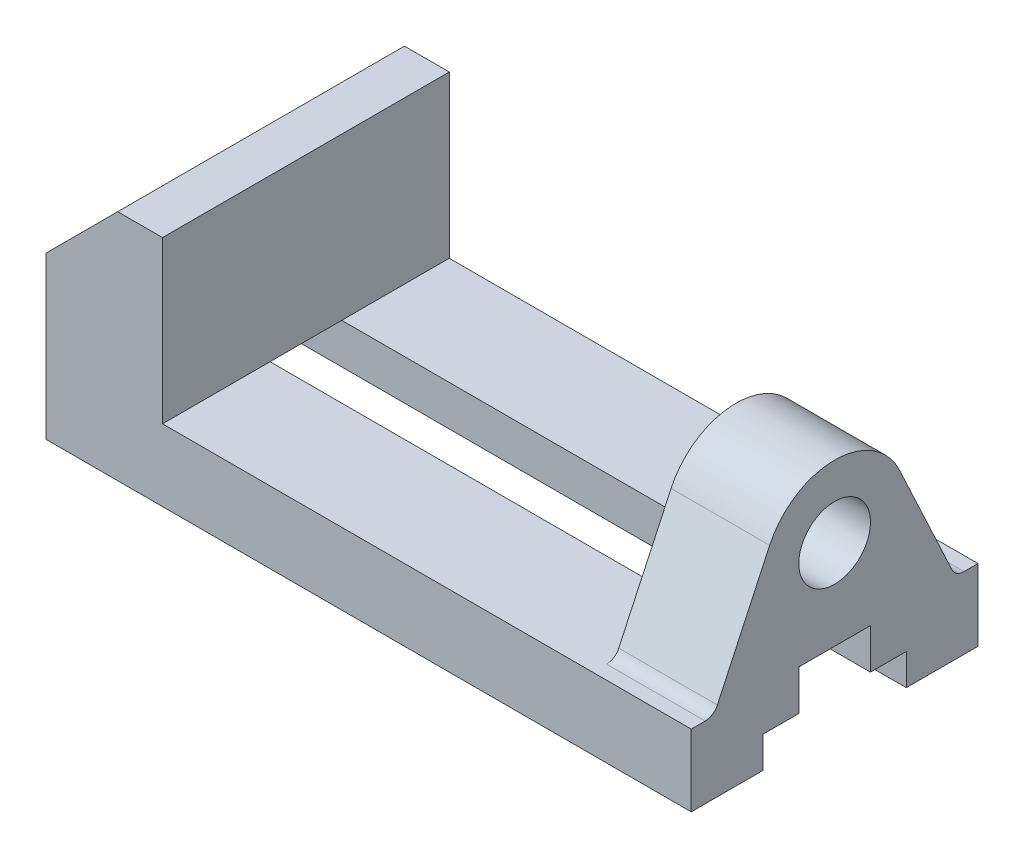
ISO-10303-21;
HEADER;
FILE_DESCRIPTION(('STEP AP214'),'2;1');
FILE_NAME('part.step','',(''),(''),'','','');
FILE_SCHEMA(('AUTOMOTIVE_DESIGN { 1 0 10303 214 1 1 1 1 }'));
ENDSEC;
DATA;
#1=APPLICATION_CONTEXT('core data for automotive mechanical design processes');
#2=APPLICATION_PROTOCOL_DEFINITION('international standard','automotive_design',2000,#1);
#3=PRODUCT_CONTEXT('',#1,'mechanical');
#4=PRODUCT('Part','Part','',(#3));
#5=PRODUCT_RELATED_PRODUCT_CATEGORY('part','',(#4));
#6=PRODUCT_DEFINITION_FORMATION('','',#4);
#7=PRODUCT_DEFINITION_CONTEXT('part definition',#1,'design');
#8=PRODUCT_DEFINITION('design','',#6,#7);
#9=PRODUCT_DEFINITION_SHAPE('','',#8);
#10=(LENGTH_UNIT() NAMED_UNIT(*) SI_UNIT(.MILLI.,.METRE.));
#11=(NAMED_UNIT(*) PLANE_ANGLE_UNIT() SI_UNIT($,.RADIAN.));
#12=(NAMED_UNIT(*) SI_UNIT($,.STERADIAN.) SOLID_ANGLE_UNIT());
#13=UNCERTAINTY_MEASURE_WITH_UNIT(LENGTH_MEASURE(1.E-05),#10,'distance_accuracy_value','');
#14=(GEOMETRIC_REPRESENTATION_CONTEXT(3) GLOBAL_UNCERTAINTY_ASSIGNED_CONTEXT((#13)) GLOBAL_UNIT_ASSIGNED_CONTEXT((#10,
#11,#12)) REPRESENTATION_CONTEXT('',''));
#15=CARTESIAN_POINT('',(0.,0.,0.));
#16=DIRECTION('',(0.,0.,1.));
#17=DIRECTION('',(1.,0.,0.));
#18=AXIS2_PLACEMENT_3D('',#15,#16,#17);
#19=CARTESIAN_POINT('',(0.,16.,0.));
#20=DIRECTION('',(0.,-1.,0.));
#21=DIRECTION('',(0.,0.,-1.));
#22=AXIS2_PLACEMENT_3D('',#19,#20,#21);
#23=PLANE('',#22);
#24=DIRECTION('',(0.,0.,-1.));
#25=VECTOR('',#24,1.);
#26=CARTESIAN_POINT('',(50.,16.,26.9801998664999));
#27=LINE('',#26,#25);
#28=CARTESIAN_POINT('',(50.,16.,28.8914106489223));
#29=VERTEX_POINT('',#28);
#30=CARTESIAN_POINT('',(50.,16.,8.));
#31=VERTEX_POINT('',#30);
#32=EDGE_CURVE('E319',#29,#31,#27,.T.);
#33=ORIENTED_EDGE('',*,*,#32,.T.);
#34=DIRECTION('',(1.,0.,0.));
#35=VECTOR('',#34,1.);
#36=CARTESIAN_POINT('',(-72.,16.,8.));
#37=LINE('',#36,#35);
#38=CARTESIAN_POINT('',(-46.,16.,8.));
#39=VERTEX_POINT('',#38);
#40=EDGE_CURVE('E67',#39,#31,#37,.T.);
#41=ORIENTED_EDGE('',*,*,#40,.F.);
#42=DIRECTION('',(0.,0.,1.));
#43=VECTOR('',#42,1.);
#44=CARTESIAN_POINT('',(-46.,16.,-76.407206622349));
#45=LINE('',#44,#43);
#46=CARTESIAN_POINT('',(-46.,16.,32.));
#47=VERTEX_POINT('',#46);
#48=EDGE_CURVE('E351',#39,#47,#45,.T.);
#49=ORIENTED_EDGE('',*,*,#48,.T.);
#50=DIRECTION('',(1.,0.,0.));
#51=VECTOR('',#50,1.);
#52=CARTESIAN_POINT('',(-72.,16.,32.));
#53=LINE('',#52,#51);
#54=CARTESIAN_POINT('',(72.,16.,32.));
#55=VERTEX_POINT('',#54);
#56=EDGE_CURVE('E370',#47,#55,#53,.T.);
#57=ORIENTED_EDGE('',*,*,#56,.T.);
#58=DIRECTION('',(0.,0.,-1.));
#59=VECTOR('',#58,1.);
#60=CARTESIAN_POINT('',(72.,16.,32.));
#61=LINE('',#60,#59);
#62=CARTESIAN_POINT('',(72.,16.,28.8914106489223));
#63=VERTEX_POINT('',#62);
#64=EDGE_CURVE('E363',#55,#63,#61,.T.);
#65=ORIENTED_EDGE('',*,*,#64,.T.);
#66=DIRECTION('',(1.,0.,0.));
#67=VECTOR('',#66,1.);
#68=CARTESIAN_POINT('',(0.,16.,28.8914106489223));
#69=LINE('',#68,#67);
#70=EDGE_CURVE('E395',#63,#29,#69,.F.);
#71=ORIENTED_EDGE('',*,*,#70,.T.);
#72=EDGE_LOOP('',(#33,#41,#49,#57,#65,#71));
#73=FACE_BOUND('',#72,.T.);
#74=ADVANCED_FACE('F44',(#73),#23,.F.);
#75=CARTESIAN_POINT('',(0.,0.,0.));
#76=DIRECTION('',(0.,-1.,0.));
#77=DIRECTION('',(0.,0.,-1.));
#78=AXIS2_PLACEMENT_3D('',#75,#76,#77);
#79=PLANE('',#78);
#80=CARTESIAN_POINT('',(34.,0.,22.));
#81=DIRECTION('',(0.,-1.,0.));
#82=DIRECTION('',(0.,0.,-1.));
#83=AXIS2_PLACEMENT_3D('',#80,#81,#82);
#84=CIRCLE('',#83,2.49999999999999);
#85=CARTESIAN_POINT('',(34.,0.,19.5));
#86=VERTEX_POINT('',#85);
#87=EDGE_CURVE('E220',#86,#86,#84,.T.);
#88=ORIENTED_EDGE('',*,*,#87,.F.);
#89=EDGE_LOOP('',(#88));
#90=FACE_BOUND('',#89,.T.);
#91=CARTESIAN_POINT('',(-36.,0.,22.));
#92=DIRECTION('',(0.,-1.,0.));
#93=DIRECTION('',(0.,0.,-1.));
#94=AXIS2_PLACEMENT_3D('',#91,#92,#93);
#95=CIRCLE('',#94,2.49999999999999);
#96=CARTESIAN_POINT('',(-36.,0.,19.5));
#97=VERTEX_POINT('',#96);
#98=EDGE_CURVE('E219',#97,#97,#95,.T.);
#99=ORIENTED_EDGE('',*,*,#98,.F.);
#100=EDGE_LOOP('',(#99));
#101=FACE_BOUND('',#100,.T.);
#102=DIRECTION('',(1.,0.,0.));
#103=VECTOR('',#102,1.);
#104=CARTESIAN_POINT('',(-72.,0.,16.));
#105=LINE('',#104,#103);
#106=CARTESIAN_POINT('',(-72.,0.,16.));
#107=VERTEX_POINT('',#106);
#108=CARTESIAN_POINT('',(72.,0.,16.));
#109=VERTEX_POINT('',#108);
#110=EDGE_CURVE('E282',#107,#109,#105,.T.);
#111=ORIENTED_EDGE('',*,*,#110,.T.);
#112=DIRECTION('',(0.,0.,-1.));
#113=VECTOR('',#112,1.);
#114=CARTESIAN_POINT('',(72.,0.,32.));
#115=LINE('',#114,#113);
#116=CARTESIAN_POINT('',(72.,0.,32.));
#117=VERTEX_POINT('',#116);
#118=EDGE_CURVE('E373',#117,#109,#115,.T.);
#119=ORIENTED_EDGE('',*,*,#118,.F.);
#120=DIRECTION('',(1.,0.,0.));
#121=VECTOR('',#120,1.);
#122=CARTESIAN_POINT('',(-72.,0.,32.));
#123=LINE('',#122,#121);
#124=CARTESIAN_POINT('',(-72.,0.,32.));
#125=VERTEX_POINT('',#124);
#126=EDGE_CURVE('E382',#125,#117,#123,.T.);
#127=ORIENTED_EDGE('',*,*,#126,.F.);
#128=DIRECTION('',(0.,0.,1.));
#129=VECTOR('',#128,1.);
#130=CARTESIAN_POINT('',(-72.,0.,32.));
#131=LINE('',#130,#129);
#132=EDGE_CURVE('E378',#107,#125,#131,.T.);
#133=ORIENTED_EDGE('',*,*,#132,.F.);
#134=EDGE_LOOP('',(#111,#119,#127,#133));
#135=FACE_BOUND('',#134,.T.);
#136=ADVANCED_FACE('F506',(#90,#101,#135),#79,.T.);
#137=CARTESIAN_POINT('',(72.,16.,32.));
#138=DIRECTION('',(-1.,0.,0.));
#139=DIRECTION('',(0.,0.,1.));
#140=AXIS2_PLACEMENT_3D('',#137,#138,#139);
#141=PLANE('',#140);
#142=ORIENTED_EDGE('',*,*,#118,.T.);
#143=DIRECTION('',(0.,-1.,0.));
#144=VECTOR('',#143,1.);
#145=CARTESIAN_POINT('',(72.,0.,16.));
#146=LINE('',#145,#144);
#147=CARTESIAN_POINT('',(72.,7.,16.));
#148=VERTEX_POINT('',#147);
#149=EDGE_CURVE('E245',#148,#109,#146,.T.);
#150=ORIENTED_EDGE('',*,*,#149,.F.);
#151=DIRECTION('',(0.,0.,1.));
#152=VECTOR('',#151,1.);
#153=CARTESIAN_POINT('',(72.,7.,16.));
#154=LINE('',#153,#152);
#155=CARTESIAN_POINT('',(72.,7.,8.));
#156=VERTEX_POINT('',#155);
#157=EDGE_CURVE('E278',#156,#148,#154,.T.);
#158=ORIENTED_EDGE('',*,*,#157,.F.);
#159=DIRECTION('',(0.,-1.,0.));
#160=VECTOR('',#159,1.);
#161=CARTESIAN_POINT('',(72.,7.,8.));
#162=LINE('',#161,#160);
#163=CARTESIAN_POINT('',(72.,16.,8.));
#164=VERTEX_POINT('',#163);
#165=EDGE_CURVE('E275',#164,#156,#162,.T.);
#166=ORIENTED_EDGE('',*,*,#165,.F.);
#167=DIRECTION('',(0.,0.,1.));
#168=VECTOR('',#167,1.);
#169=CARTESIAN_POINT('',(72.,16.,8.));
#170=LINE('',#169,#168);
#171=CARTESIAN_POINT('',(72.,16.,-8.));
#172=VERTEX_POINT('',#171);
#173=EDGE_CURVE('E272',#172,#164,#170,.T.);
#174=ORIENTED_EDGE('',*,*,#173,.F.);
#175=DIRECTION('',(0.,1.,0.));
#176=VECTOR('',#175,1.);
#177=CARTESIAN_POINT('',(72.,7.00000000000001,-8.00000000000001));
#178=LINE('',#177,#176);
#179=CARTESIAN_POINT('',(72.,7.00000000000001,-8.00000000000001));
#180=VERTEX_POINT('',#179);
#181=EDGE_CURVE('E269',#180,#172,#178,.T.);
#182=ORIENTED_EDGE('',*,*,#181,.F.);
#183=DIRECTION('',(0.,0.,1.));
#184=VECTOR('',#183,1.);
#185=CARTESIAN_POINT('',(72.,7.00000000000002,-16.));
#186=LINE('',#185,#184);
#187=CARTESIAN_POINT('',(72.,7.00000000000002,-16.));
#188=VERTEX_POINT('',#187);
#189=EDGE_CURVE('E266',#188,#180,#186,.T.);
#190=ORIENTED_EDGE('',*,*,#189,.F.);
#191=DIRECTION('',(0.,1.,0.));
#192=VECTOR('',#191,1.);
#193=CARTESIAN_POINT('',(72.,0.,-16.));
#194=LINE('',#193,#192);
#195=CARTESIAN_POINT('',(72.,0.,-16.));
#196=VERTEX_POINT('',#195);
#197=EDGE_CURVE('E242',#196,#188,#194,.T.);
#198=ORIENTED_EDGE('',*,*,#197,.F.);
#199=CARTESIAN_POINT('',(72.,0.,-32.));
#200=VERTEX_POINT('',#199);
#201=EDGE_CURVE('E362',#196,#200,#115,.T.);
#202=ORIENTED_EDGE('',*,*,#201,.T.);
#203=DIRECTION('',(0.,-1.,0.));
#204=VECTOR('',#203,1.);
#205=CARTESIAN_POINT('',(72.,16.,-32.));
#206=LINE('',#205,#204);
#207=CARTESIAN_POINT('',(72.,16.,-32.));
#208=VERTEX_POINT('',#207);
#209=EDGE_CURVE('E392',#208,#200,#206,.T.);
#210=ORIENTED_EDGE('',*,*,#209,.F.);
#211=CARTESIAN_POINT('',(72.,16.,-28.8914106489224));
#212=VERTEX_POINT('',#211);
#213=EDGE_CURVE('E367',#212,#208,#61,.T.);
#214=ORIENTED_EDGE('',*,*,#213,.F.);
#215=CARTESIAN_POINT('',(72.,19.,-28.8914106489224));
#216=DIRECTION('',(-1.,0.,0.));
#217=DIRECTION('',(0.,0.,1.));
#218=AXIS2_PLACEMENT_3D('',#215,#216,#217);
#219=CIRCLE('',#218,3.);
#220=CARTESIAN_POINT('',(72.,17.7321452147779,-26.1724872878124));
#221=VERTEX_POINT('',#220);
#222=EDGE_CURVE('E406',#212,#221,#219,.T.);
#223=ORIENTED_EDGE('',*,*,#222,.T.);
#224=DIRECTION('',(0.,0.90630778703665,0.4226182617407));
#225=VECTOR('',#224,1.);
#226=CARTESIAN_POINT('',(72.,42.7618921878512,-14.5009245925864));
#227=LINE('',#226,#225);
#228=CARTESIAN_POINT('',(72.,42.7618921878512,-14.5009245925864));
#229=VERTEX_POINT('',#228);
#230=EDGE_CURVE('E315',#221,#229,#227,.T.);
#231=ORIENTED_EDGE('',*,*,#230,.T.);
#232=CARTESIAN_POINT('',(72.,36.,0.));
#233=DIRECTION('',(1.,0.,0.));
#234=DIRECTION('',(0.,0.,-1.));
#235=AXIS2_PLACEMENT_3D('',#232,#233,#234);
#236=CIRCLE('',#235,16.);
#237=CARTESIAN_POINT('',(72.,42.7618921878512,14.5009245925864));
#238=VERTEX_POINT('',#237);
#239=EDGE_CURVE('E308',#229,#238,#236,.T.);
#240=ORIENTED_EDGE('',*,*,#239,.T.);
#241=DIRECTION('',(0.,-0.90630778703665,0.4226182617407));
#242=VECTOR('',#241,1.);
#243=CARTESIAN_POINT('',(72.,42.7618921878512,14.5009245925864));
#244=LINE('',#243,#242);
#245=CARTESIAN_POINT('',(72.,17.7321452147779,26.1724872878124));
#246=VERTEX_POINT('',#245);
#247=EDGE_CURVE('E328',#238,#246,#244,.T.);
#248=ORIENTED_EDGE('',*,*,#247,.T.);
#249=CARTESIAN_POINT('',(72.,19.,28.8914106489223));
#250=DIRECTION('',(-1.,0.,0.));
#251=DIRECTION('',(0.,0.,1.));
#252=AXIS2_PLACEMENT_3D('',#249,#250,#251);
#253=CIRCLE('',#252,3.);
#254=EDGE_CURVE('E52',#246,#63,#253,.T.);
#255=ORIENTED_EDGE('',*,*,#254,.T.);
#256=ORIENTED_EDGE('',*,*,#64,.F.);
#257=DIRECTION('',(0.,-1.,0.));
#258=VECTOR('',#257,1.);
#259=CARTESIAN_POINT('',(72.,16.,32.));
#260=LINE('',#259,#258);
#261=EDGE_CURVE('E372',#55,#117,#260,.T.);
#262=ORIENTED_EDGE('',*,*,#261,.T.);
#263=EDGE_LOOP('',(#142,#150,#158,#166,#174,#182,#190,#198,#202,#210,#214,#223,#231,#240,#248,
#255,#256,#262));
#264=FACE_BOUND('',#263,.T.);
#265=CARTESIAN_POINT('',(72.,36.,0.));
#266=DIRECTION('',(1.,0.,0.));
#267=DIRECTION('',(0.,0.,-1.));
#268=AXIS2_PLACEMENT_3D('',#265,#266,#267);
#269=CIRCLE('',#268,8.);
#270=CARTESIAN_POINT('',(72.,36.,-8.));
#271=VERTEX_POINT('',#270);
#272=EDGE_CURVE('E304',#271,#271,#269,.T.);
#273=ORIENTED_EDGE('',*,*,#272,.F.);
#274=EDGE_LOOP('',(#273));
#275=FACE_BOUND('',#274,.T.);
#276=ADVANCED_FACE('F412',(#264,#275),#141,.F.);
#277=CARTESIAN_POINT('',(-72.,16.,-32.));
#278=DIRECTION('',(0.,0.,1.));
#279=DIRECTION('',(1.,0.,0.));
#280=AXIS2_PLACEMENT_3D('',#277,#278,#279);
#281=PLANE('',#280);
#282=DIRECTION('',(-1.,0.,0.));
#283=VECTOR('',#282,1.);
#284=CARTESIAN_POINT('',(-72.,0.,-32.));
#285=LINE('',#284,#283);
#286=CARTESIAN_POINT('',(-72.,0.,-32.));
#287=VERTEX_POINT('',#286);
#288=EDGE_CURVE('E376',#200,#287,#285,.T.);
#289=ORIENTED_EDGE('',*,*,#288,.T.);
#290=DIRECTION('',(0.,-1.,0.));
#291=VECTOR('',#290,1.);
#292=CARTESIAN_POINT('',(-72.,16.,-32.));
#293=LINE('',#292,#291);
#294=CARTESIAN_POINT('',(-72.,36.,-32.));
#295=VERTEX_POINT('',#294);
#296=EDGE_CURVE('E389',#295,#287,#293,.T.);
#297=ORIENTED_EDGE('',*,*,#296,.F.);
#298=DIRECTION('',(0.707106781186548,0.707106781186547,0.));
#299=VECTOR('',#298,1.);
#300=CARTESIAN_POINT('',(-56.,52.,-32.));
#301=LINE('',#300,#299);
#302=CARTESIAN_POINT('',(-56.,52.,-32.));
#303=VERTEX_POINT('',#302);
#304=EDGE_CURVE('E339',#295,#303,#301,.T.);
#305=ORIENTED_EDGE('',*,*,#304,.T.);
#306=DIRECTION('',(1.,0.,0.));
#307=VECTOR('',#306,1.);
#308=CARTESIAN_POINT('',(-46.,52.,-32.));
#309=LINE('',#308,#307);
#310=CARTESIAN_POINT('',(-46.,52.,-32.));
#311=VERTEX_POINT('',#310);
#312=EDGE_CURVE('E337',#303,#311,#309,.T.);
#313=ORIENTED_EDGE('',*,*,#312,.T.);
#314=DIRECTION('',(0.,-1.,0.));
#315=VECTOR('',#314,1.);
#316=CARTESIAN_POINT('',(-46.,16.,-32.));
#317=LINE('',#316,#315);
#318=CARTESIAN_POINT('',(-46.,16.,-32.));
#319=VERTEX_POINT('',#318);
#320=EDGE_CURVE('E342',#311,#319,#317,.T.);
#321=ORIENTED_EDGE('',*,*,#320,.T.);
#322=DIRECTION('',(-1.,0.,0.));
#323=VECTOR('',#322,1.);
#324=CARTESIAN_POINT('',(-72.,16.,-32.));
#325=LINE('',#324,#323);
#326=EDGE_CURVE('E366',#208,#319,#325,.T.);
#327=ORIENTED_EDGE('',*,*,#326,.F.);
#328=ORIENTED_EDGE('',*,*,#209,.T.);
#329=EDGE_LOOP('',(#289,#297,#305,#313,#321,#327,#328));
#330=FACE_BOUND('',#329,.T.);
#331=ADVANCED_FACE('F452',(#330),#281,.F.);
#332=CARTESIAN_POINT('',(-72.,16.,32.));
#333=DIRECTION('',(1.,0.,0.));
#334=DIRECTION('',(0.,0.,-1.));
#335=AXIS2_PLACEMENT_3D('',#332,#333,#334);
#336=PLANE('',#335);
#337=DIRECTION('',(0.,0.,1.));
#338=VECTOR('',#337,1.);
#339=CARTESIAN_POINT('',(-72.,7.,16.));
#340=LINE('',#339,#338);
#341=CARTESIAN_POINT('',(-72.,7.,8.));
#342=VERTEX_POINT('',#341);
#343=CARTESIAN_POINT('',(-72.,7.,16.));
#344=VERTEX_POINT('',#343);
#345=EDGE_CURVE('E257',#342,#344,#340,.T.);
#346=ORIENTED_EDGE('',*,*,#345,.T.);
#347=DIRECTION('',(0.,-1.,0.));
#348=VECTOR('',#347,1.);
#349=CARTESIAN_POINT('',(-72.,0.,16.));
#350=LINE('',#349,#348);
#351=EDGE_CURVE('E260',#344,#107,#350,.T.);
#352=ORIENTED_EDGE('',*,*,#351,.T.);
#353=ORIENTED_EDGE('',*,*,#132,.T.);
#354=DIRECTION('',(0.,-1.,0.));
#355=VECTOR('',#354,1.);
#356=CARTESIAN_POINT('',(-72.,16.,32.));
#357=LINE('',#356,#355);
#358=CARTESIAN_POINT('',(-72.,36.,32.));
#359=VERTEX_POINT('',#358);
#360=EDGE_CURVE('E386',#359,#125,#357,.T.);
#361=ORIENTED_EDGE('',*,*,#360,.F.);
#362=DIRECTION('',(0.,0.,1.));
#363=VECTOR('',#362,1.);
#364=CARTESIAN_POINT('',(-72.,36.,-76.407206622349));
#365=LINE('',#364,#363);
#366=EDGE_CURVE('E340',#295,#359,#365,.T.);
#367=ORIENTED_EDGE('',*,*,#366,.F.);
#368=ORIENTED_EDGE('',*,*,#296,.T.);
#369=CARTESIAN_POINT('',(-72.,0.,-16.));
#370=VERTEX_POINT('',#369);
#371=EDGE_CURVE('E379',#287,#370,#131,.T.);
#372=ORIENTED_EDGE('',*,*,#371,.T.);
#373=DIRECTION('',(0.,1.,0.));
#374=VECTOR('',#373,1.);
#375=CARTESIAN_POINT('',(-72.,0.,-16.));
#376=LINE('',#375,#374);
#377=CARTESIAN_POINT('',(-72.,7.00000000000002,-16.));
#378=VERTEX_POINT('',#377);
#379=EDGE_CURVE('E59',#370,#378,#376,.T.);
#380=ORIENTED_EDGE('',*,*,#379,.T.);
#381=DIRECTION('',(0.,0.,1.));
#382=VECTOR('',#381,1.);
#383=CARTESIAN_POINT('',(-72.,7.00000000000002,-16.));
#384=LINE('',#383,#382);
#385=CARTESIAN_POINT('',(-72.,7.00000000000001,-8.00000000000001));
#386=VERTEX_POINT('',#385);
#387=EDGE_CURVE('E244',#378,#386,#384,.T.);
#388=ORIENTED_EDGE('',*,*,#387,.T.);
#389=DIRECTION('',(0.,1.,0.));
#390=VECTOR('',#389,1.);
#391=CARTESIAN_POINT('',(-72.,7.00000000000001,-8.00000000000001));
#392=LINE('',#391,#390);
#393=CARTESIAN_POINT('',(-72.,16.,-8.));
#394=VERTEX_POINT('',#393);
#395=EDGE_CURVE('E248',#386,#394,#392,.T.);
#396=ORIENTED_EDGE('',*,*,#395,.T.);
#397=DIRECTION('',(0.,0.,1.));
#398=VECTOR('',#397,1.);
#399=CARTESIAN_POINT('',(-72.,16.,8.));
#400=LINE('',#399,#398);
#401=CARTESIAN_POINT('',(-72.,16.,8.));
#402=VERTEX_POINT('',#401);
#403=EDGE_CURVE('E251',#394,#402,#400,.T.);
#404=ORIENTED_EDGE('',*,*,#403,.T.);
#405=DIRECTION('',(0.,-1.,0.));
#406=VECTOR('',#405,1.);
#407=CARTESIAN_POINT('',(-72.,7.,8.));
#408=LINE('',#407,#406);
#409=EDGE_CURVE('E254',#402,#342,#408,.T.);
#410=ORIENTED_EDGE('',*,*,#409,.T.);
#411=EDGE_LOOP('',(#346,#352,#353,#361,#367,#368,#372,#380,#388,#396,#404,#410));
#412=FACE_BOUND('',#411,.T.);
#413=ADVANCED_FACE('F478',(#412),#336,.F.);
#414=CARTESIAN_POINT('',(-72.,16.,32.));
#415=DIRECTION('',(0.,0.,-1.));
#416=DIRECTION('',(-1.,0.,0.));
#417=AXIS2_PLACEMENT_3D('',#414,#415,#416);
#418=PLANE('',#417);
#419=ORIENTED_EDGE('',*,*,#126,.T.);
#420=ORIENTED_EDGE('',*,*,#261,.F.);
#421=ORIENTED_EDGE('',*,*,#56,.F.);
#422=DIRECTION('',(0.,1.,0.));
#423=VECTOR('',#422,1.);
#424=CARTESIAN_POINT('',(-46.,16.,32.));
#425=LINE('',#424,#423);
#426=CARTESIAN_POINT('',(-46.,52.,32.));
#427=VERTEX_POINT('',#426);
#428=EDGE_CURVE('E335',#47,#427,#425,.T.);
#429=ORIENTED_EDGE('',*,*,#428,.T.);
#430=DIRECTION('',(-1.,0.,0.));
#431=VECTOR('',#430,1.);
#432=CARTESIAN_POINT('',(-46.,52.,32.));
#433=LINE('',#432,#431);
#434=CARTESIAN_POINT('',(-56.,52.,32.));
#435=VERTEX_POINT('',#434);
#436=EDGE_CURVE('E345',#427,#435,#433,.T.);
#437=ORIENTED_EDGE('',*,*,#436,.T.);
#438=DIRECTION('',(-0.707106781186548,-0.707106781186547,0.));
#439=VECTOR('',#438,1.);
#440=CARTESIAN_POINT('',(-56.,52.,32.));
#441=LINE('',#440,#439);
#442=EDGE_CURVE('E348',#435,#359,#441,.T.);
#443=ORIENTED_EDGE('',*,*,#442,.T.);
#444=ORIENTED_EDGE('',*,*,#360,.T.);
#445=EDGE_LOOP('',(#419,#420,#421,#429,#437,#443,#444));
#446=FACE_BOUND('',#445,.T.);
#447=ADVANCED_FACE('F502',(#446),#418,.F.);
#448=CARTESIAN_POINT('',(-46.,16.,-8.));
#449=VERTEX_POINT('',#448);
#450=EDGE_CURVE('E358',#319,#449,#45,.T.);
#451=ORIENTED_EDGE('',*,*,#450,.T.);
#452=DIRECTION('',(1.,0.,0.));
#453=VECTOR('',#452,1.);
#454=CARTESIAN_POINT('',(-72.,16.,-8.));
#455=LINE('',#454,#453);
#456=CARTESIAN_POINT('',(50.,16.,-8.));
#457=VERTEX_POINT('',#456);
#458=EDGE_CURVE('E296',#449,#457,#455,.T.);
#459=ORIENTED_EDGE('',*,*,#458,.T.);
#460=CARTESIAN_POINT('',(50.,16.,-28.8914106489224));
#461=VERTEX_POINT('',#460);
#462=EDGE_CURVE('E318',#457,#461,#27,.T.);
#463=ORIENTED_EDGE('',*,*,#462,.T.);
#464=DIRECTION('',(1.,0.,0.));
#465=VECTOR('',#464,1.);
#466=CARTESIAN_POINT('',(0.,16.,-28.8914106489224));
#467=LINE('',#466,#465);
#468=EDGE_CURVE('E398',#461,#212,#467,.T.);
#469=ORIENTED_EDGE('',*,*,#468,.T.);
#470=ORIENTED_EDGE('',*,*,#213,.T.);
#471=ORIENTED_EDGE('',*,*,#326,.T.);
#472=EDGE_LOOP('',(#451,#459,#463,#469,#470,#471));
#473=FACE_BOUND('',#472,.T.);
#474=ADVANCED_FACE('F443',(#473),#23,.F.);
#475=CARTESIAN_POINT('',(-36.,0.,-22.));
#476=DIRECTION('',(0.,-1.,0.));
#477=DIRECTION('',(0.,0.,-1.));
#478=AXIS2_PLACEMENT_3D('',#475,#476,#477);
#479=CIRCLE('',#478,2.49999999999999);
#480=CARTESIAN_POINT('',(-36.,0.,-24.5));
#481=VERTEX_POINT('',#480);
#482=EDGE_CURVE('E230',#481,#481,#479,.T.);
#483=ORIENTED_EDGE('',*,*,#482,.F.);
#484=EDGE_LOOP('',(#483));
#485=FACE_BOUND('',#484,.T.);
#486=CARTESIAN_POINT('',(34.,0.,-22.));
#487=DIRECTION('',(0.,-1.,0.));
#488=DIRECTION('',(0.,0.,-1.));
#489=AXIS2_PLACEMENT_3D('',#486,#487,#488);
#490=CIRCLE('',#489,2.49999999999999);
#491=CARTESIAN_POINT('',(34.,0.,-24.5));
#492=VERTEX_POINT('',#491);
#493=EDGE_CURVE('E236',#492,#492,#490,.T.);
#494=ORIENTED_EDGE('',*,*,#493,.F.);
#495=EDGE_LOOP('',(#494));
#496=FACE_BOUND('',#495,.T.);
#497=DIRECTION('',(1.,0.,0.));
#498=VECTOR('',#497,1.);
#499=CARTESIAN_POINT('',(-72.,0.,-16.));
#500=LINE('',#499,#498);
#501=EDGE_CURVE('E263',#370,#196,#500,.T.);
#502=ORIENTED_EDGE('',*,*,#501,.F.);
#503=ORIENTED_EDGE('',*,*,#371,.F.);
#504=ORIENTED_EDGE('',*,*,#288,.F.);
#505=ORIENTED_EDGE('',*,*,#201,.F.);
#506=EDGE_LOOP('',(#502,#503,#504,#505));
#507=FACE_BOUND('',#506,.T.);
#508=ADVANCED_FACE('F489',(#485,#496,#507),#79,.T.);
#509=CARTESIAN_POINT('',(-56.,52.,-76.407206622349));
#510=DIRECTION('',(-0.707106781186547,0.707106781186548,0.));
#511=DIRECTION('',(-0.707106781186548,-0.707106781186547,0.));
#512=AXIS2_PLACEMENT_3D('',#509,#510,#511);
#513=PLANE('',#512);
#514=ORIENTED_EDGE('',*,*,#304,.F.);
#515=ORIENTED_EDGE('',*,*,#366,.T.);
#516=ORIENTED_EDGE('',*,*,#442,.F.);
#517=DIRECTION('',(0.,0.,1.));
#518=VECTOR('',#517,1.);
#519=CARTESIAN_POINT('',(-56.,52.,-76.407206622349));
#520=LINE('',#519,#518);
#521=EDGE_CURVE('E354',#303,#435,#520,.T.);
#522=ORIENTED_EDGE('',*,*,#521,.F.);
#523=EDGE_LOOP('',(#514,#515,#516,#522));
#524=FACE_BOUND('',#523,.T.);
#525=ADVANCED_FACE('F495',(#524),#513,.T.);
#526=CARTESIAN_POINT('',(-46.,52.,-76.407206622349));
#527=DIRECTION('',(0.,1.,0.));
#528=DIRECTION('',(0.,0.,1.));
#529=AXIS2_PLACEMENT_3D('',#526,#527,#528);
#530=PLANE('',#529);
#531=ORIENTED_EDGE('',*,*,#312,.F.);
#532=ORIENTED_EDGE('',*,*,#521,.T.);
#533=ORIENTED_EDGE('',*,*,#436,.F.);
#534=DIRECTION('',(0.,0.,1.));
#535=VECTOR('',#534,1.);
#536=CARTESIAN_POINT('',(-46.,52.,-76.407206622349));
#537=LINE('',#536,#535);
#538=EDGE_CURVE('E356',#311,#427,#537,.T.);
#539=ORIENTED_EDGE('',*,*,#538,.F.);
#540=EDGE_LOOP('',(#531,#532,#533,#539));
#541=FACE_BOUND('',#540,.T.);
#542=ADVANCED_FACE('F499',(#541),#530,.T.);
#543=CARTESIAN_POINT('',(-46.,16.,-76.407206622349));
#544=DIRECTION('',(1.,0.,0.));
#545=DIRECTION('',(0.,0.,-1.));
#546=AXIS2_PLACEMENT_3D('',#543,#544,#545);
#547=PLANE('',#546);
#548=ORIENTED_EDGE('',*,*,#320,.F.);
#549=ORIENTED_EDGE('',*,*,#538,.T.);
#550=ORIENTED_EDGE('',*,*,#428,.F.);
#551=ORIENTED_EDGE('',*,*,#48,.F.);
#552=DIRECTION('',(0.,0.,1.));
#553=VECTOR('',#552,1.);
#554=CARTESIAN_POINT('',(-46.,16.,-76.407206622349));
#555=LINE('',#554,#553);
#556=EDGE_CURVE('E285',#449,#39,#555,.T.);
#557=ORIENTED_EDGE('',*,*,#556,.F.);
#558=ORIENTED_EDGE('',*,*,#450,.F.);
#559=EDGE_LOOP('',(#548,#549,#550,#551,#557,#558));
#560=FACE_BOUND('',#559,.T.);
#561=ADVANCED_FACE('F457',(#560),#547,.T.);
#562=CARTESIAN_POINT('',(50.,36.,0.));
#563=DIRECTION('',(1.,0.,0.));
#564=DIRECTION('',(0.,0.,-1.));
#565=AXIS2_PLACEMENT_3D('',#562,#563,#564);
#566=CYLINDRICAL_SURFACE('',#565,16.);
#567=ORIENTED_EDGE('',*,*,#239,.F.);
#568=DIRECTION('',(1.,0.,0.));
#569=VECTOR('',#568,1.);
#570=CARTESIAN_POINT('',(50.,42.7618921878512,-14.5009245925864));
#571=LINE('',#570,#569);
#572=CARTESIAN_POINT('',(50.,42.7618921878512,-14.5009245925864));
#573=VERTEX_POINT('',#572);
#574=EDGE_CURVE('E332',#573,#229,#571,.T.);
#575=ORIENTED_EDGE('',*,*,#574,.F.);
#576=CARTESIAN_POINT('',(50.,36.,0.));
#577=DIRECTION('',(1.,0.,0.));
#578=DIRECTION('',(0.,0.,-1.));
#579=AXIS2_PLACEMENT_3D('',#576,#577,#578);
#580=CIRCLE('',#579,16.);
#581=CARTESIAN_POINT('',(50.,42.7618921878512,14.5009245925864));
#582=VERTEX_POINT('',#581);
#583=EDGE_CURVE('E311',#573,#582,#580,.T.);
#584=ORIENTED_EDGE('',*,*,#583,.T.);
#585=DIRECTION('',(1.,0.,0.));
#586=VECTOR('',#585,1.);
#587=CARTESIAN_POINT('',(50.,42.7618921878512,14.5009245925864));
#588=LINE('',#587,#586);
#589=EDGE_CURVE('E325',#582,#238,#588,.T.);
#590=ORIENTED_EDGE('',*,*,#589,.T.);
#591=EDGE_LOOP('',(#567,#575,#584,#590));
#592=FACE_BOUND('',#591,.T.);
#593=ADVANCED_FACE('F431',(#592),#566,.T.);
#594=CARTESIAN_POINT('',(50.,42.7618921878512,-14.5009245925864));
#595=DIRECTION('',(0.,0.4226182617407,-0.90630778703665));
#596=DIRECTION('',(0.,0.90630778703665,0.4226182617407));
#597=AXIS2_PLACEMENT_3D('',#594,#595,#596);
#598=PLANE('',#597);
#599=ORIENTED_EDGE('',*,*,#230,.F.);
#600=DIRECTION('',(1.,0.,0.));
#601=VECTOR('',#600,1.);
#602=CARTESIAN_POINT('',(50.,17.7321452147779,-26.1724872878124));
#603=LINE('',#602,#601);
#604=CARTESIAN_POINT('',(50.,17.7321452147779,-26.1724872878124));
#605=VERTEX_POINT('',#604);
#606=EDGE_CURVE('E401',#221,#605,#603,.F.);
#607=ORIENTED_EDGE('',*,*,#606,.T.);
#608=DIRECTION('',(0.,0.90630778703665,0.4226182617407));
#609=VECTOR('',#608,1.);
#610=CARTESIAN_POINT('',(50.,42.7618921878512,-14.5009245925864));
#611=LINE('',#610,#609);
#612=EDGE_CURVE('E322',#605,#573,#611,.T.);
#613=ORIENTED_EDGE('',*,*,#612,.T.);
#614=ORIENTED_EDGE('',*,*,#574,.T.);
#615=EDGE_LOOP('',(#599,#607,#613,#614));
#616=FACE_BOUND('',#615,.T.);
#617=ADVANCED_FACE('F560',(#616),#598,.T.);
#618=CARTESIAN_POINT('',(50.,42.7618921878512,14.5009245925864));
#619=DIRECTION('',(0.,0.4226182617407,0.90630778703665));
#620=DIRECTION('',(0.,-0.90630778703665,0.4226182617407));
#621=AXIS2_PLACEMENT_3D('',#618,#619,#620);
#622=PLANE('',#621);
#623=DIRECTION('',(0.,-0.90630778703665,0.4226182617407));
#624=VECTOR('',#623,1.);
#625=CARTESIAN_POINT('',(50.,42.7618921878512,14.5009245925864));
#626=LINE('',#625,#624);
#627=CARTESIAN_POINT('',(50.,17.7321452147779,26.1724872878124));
#628=VERTEX_POINT('',#627);
#629=EDGE_CURVE('E314',#582,#628,#626,.T.);
#630=ORIENTED_EDGE('',*,*,#629,.T.);
#631=DIRECTION('',(1.,0.,0.));
#632=VECTOR('',#631,1.);
#633=CARTESIAN_POINT('',(50.,17.7321452147779,26.1724872878124));
#634=LINE('',#633,#632);
#635=EDGE_CURVE('E403',#628,#246,#634,.T.);
#636=ORIENTED_EDGE('',*,*,#635,.T.);
#637=ORIENTED_EDGE('',*,*,#247,.F.);
#638=ORIENTED_EDGE('',*,*,#589,.F.);
#639=EDGE_LOOP('',(#630,#636,#637,#638));
#640=FACE_BOUND('',#639,.T.);
#641=ADVANCED_FACE('F428',(#640),#622,.T.);
#642=CARTESIAN_POINT('',(50.,36.,0.));
#643=DIRECTION('',(1.,0.,0.));
#644=DIRECTION('',(0.,0.,-1.));
#645=AXIS2_PLACEMENT_3D('',#642,#643,#644);
#646=PLANE('',#645);
#647=CARTESIAN_POINT('',(50.,36.,0.));
#648=DIRECTION('',(1.,0.,0.));
#649=DIRECTION('',(0.,0.,-1.));
#650=AXIS2_PLACEMENT_3D('',#647,#648,#649);
#651=CIRCLE('',#650,8.);
#652=CARTESIAN_POINT('',(50.,36.,-8.));
#653=VERTEX_POINT('',#652);
#654=EDGE_CURVE('E305',#653,#653,#651,.T.);
#655=ORIENTED_EDGE('',*,*,#654,.T.);
#656=EDGE_LOOP('',(#655));
#657=FACE_BOUND('',#656,.T.);
#658=ORIENTED_EDGE('',*,*,#583,.F.);
#659=ORIENTED_EDGE('',*,*,#612,.F.);
#660=CARTESIAN_POINT('',(50.,19.,-28.8914106489224));
#661=DIRECTION('',(1.,0.,0.));
#662=DIRECTION('',(0.,0.,-1.));
#663=AXIS2_PLACEMENT_3D('',#660,#661,#662);
#664=CIRCLE('',#663,3.);
#665=EDGE_CURVE('E408',#605,#461,#664,.T.);
#666=ORIENTED_EDGE('',*,*,#665,.T.);
#667=ORIENTED_EDGE('',*,*,#462,.F.);
#668=EDGE_CURVE('E323',#31,#457,#27,.T.);
#669=ORIENTED_EDGE('',*,*,#668,.F.);
#670=ORIENTED_EDGE('',*,*,#32,.F.);
#671=CARTESIAN_POINT('',(50.,19.,28.8914106489223));
#672=DIRECTION('',(1.,0.,0.));
#673=DIRECTION('',(0.,0.,-1.));
#674=AXIS2_PLACEMENT_3D('',#671,#672,#673);
#675=CIRCLE('',#674,3.);
#676=EDGE_CURVE('E11',#29,#628,#675,.T.);
#677=ORIENTED_EDGE('',*,*,#676,.T.);
#678=ORIENTED_EDGE('',*,*,#629,.F.);
#679=EDGE_LOOP('',(#658,#659,#666,#667,#669,#670,#677,#678));
#680=FACE_BOUND('',#679,.T.);
#681=ADVANCED_FACE('F425',(#657,#680),#646,.F.);
#682=CARTESIAN_POINT('',(50.,36.,0.));
#683=DIRECTION('',(1.,0.,0.));
#684=DIRECTION('',(0.,0.,-1.));
#685=AXIS2_PLACEMENT_3D('',#682,#683,#684);
#686=CYLINDRICAL_SURFACE('',#685,8.);
#687=ORIENTED_EDGE('',*,*,#654,.F.);
#688=EDGE_LOOP('',(#687));
#689=FACE_BOUND('',#688,.T.);
#690=ORIENTED_EDGE('',*,*,#272,.T.);
#691=EDGE_LOOP('',(#690));
#692=FACE_BOUND('',#691,.T.);
#693=ADVANCED_FACE('F543',(#689,#692),#686,.F.);
#694=CARTESIAN_POINT('',(0.,19.,-28.8914106489224));
#695=DIRECTION('',(1.,0.,0.));
#696=DIRECTION('',(0.,0.,-1.));
#697=AXIS2_PLACEMENT_3D('',#694,#695,#696);
#698=CYLINDRICAL_SURFACE('',#697,3.);
#699=ORIENTED_EDGE('',*,*,#665,.F.);
#700=ORIENTED_EDGE('',*,*,#606,.F.);
#701=ORIENTED_EDGE('',*,*,#222,.F.);
#702=ORIENTED_EDGE('',*,*,#468,.F.);
#703=EDGE_LOOP('',(#699,#700,#701,#702));
#704=FACE_BOUND('',#703,.T.);
#705=ADVANCED_FACE('F440',(#704),#698,.F.);
#706=CARTESIAN_POINT('',(50.,19.,28.8914106489223));
#707=DIRECTION('',(1.,0.,0.));
#708=DIRECTION('',(0.,0.,-1.));
#709=AXIS2_PLACEMENT_3D('',#706,#707,#708);
#710=CYLINDRICAL_SURFACE('',#709,3.);
#711=ORIENTED_EDGE('',*,*,#676,.F.);
#712=ORIENTED_EDGE('',*,*,#70,.F.);
#713=ORIENTED_EDGE('',*,*,#254,.F.);
#714=ORIENTED_EDGE('',*,*,#635,.F.);
#715=EDGE_LOOP('',(#711,#712,#713,#714));
#716=FACE_BOUND('',#715,.T.);
#717=ADVANCED_FACE('F46',(#716),#710,.F.);
#718=CARTESIAN_POINT('',(-72.,16.,8.));
#719=DIRECTION('',(0.,1.,0.));
#720=DIRECTION('',(0.,0.,1.));
#721=AXIS2_PLACEMENT_3D('',#718,#719,#720);
#722=PLANE('',#721);
#723=EDGE_CURVE('E297',#457,#172,#455,.T.);
#724=ORIENTED_EDGE('',*,*,#723,.T.);
#725=ORIENTED_EDGE('',*,*,#173,.T.);
#726=EDGE_CURVE('E292',#31,#164,#37,.T.);
#727=ORIENTED_EDGE('',*,*,#726,.F.);
#728=ORIENTED_EDGE('',*,*,#668,.T.);
#729=EDGE_LOOP('',(#724,#725,#727,#728));
#730=FACE_BOUND('',#729,.T.);
#731=ADVANCED_FACE('F469',(#730),#722,.F.);
#732=CARTESIAN_POINT('',(-72.,0.,16.));
#733=DIRECTION('',(0.,0.,1.));
#734=DIRECTION('',(1.,0.,0.));
#735=AXIS2_PLACEMENT_3D('',#732,#733,#734);
#736=PLANE('',#735);
#737=ORIENTED_EDGE('',*,*,#149,.T.);
#738=ORIENTED_EDGE('',*,*,#110,.F.);
#739=ORIENTED_EDGE('',*,*,#351,.F.);
#740=DIRECTION('',(1.,0.,0.));
#741=VECTOR('',#740,1.);
#742=CARTESIAN_POINT('',(-72.,7.,16.));
#743=LINE('',#742,#741);
#744=EDGE_CURVE('E286',#344,#148,#743,.T.);
#745=ORIENTED_EDGE('',*,*,#744,.T.);
#746=EDGE_LOOP('',(#737,#738,#739,#745));
#747=FACE_BOUND('',#746,.T.);
#748=ADVANCED_FACE('F509',(#747),#736,.F.);
#749=CARTESIAN_POINT('',(-72.,7.,16.));
#750=DIRECTION('',(0.,1.,0.));
#751=DIRECTION('',(0.,0.,1.));
#752=AXIS2_PLACEMENT_3D('',#749,#750,#751);
#753=PLANE('',#752);
#754=ORIENTED_EDGE('',*,*,#157,.T.);
#755=ORIENTED_EDGE('',*,*,#744,.F.);
#756=ORIENTED_EDGE('',*,*,#345,.F.);
#757=DIRECTION('',(1.,0.,0.));
#758=VECTOR('',#757,1.);
#759=CARTESIAN_POINT('',(-72.,7.,8.));
#760=LINE('',#759,#758);
#761=EDGE_CURVE('E288',#342,#156,#760,.T.);
#762=ORIENTED_EDGE('',*,*,#761,.T.);
#763=EDGE_LOOP('',(#754,#755,#756,#762));
#764=FACE_BOUND('',#763,.T.);
#765=ADVANCED_FACE('F474',(#764),#753,.F.);
#766=CARTESIAN_POINT('',(-72.,7.,8.));
#767=DIRECTION('',(0.,0.,1.));
#768=DIRECTION('',(1.,0.,0.));
#769=AXIS2_PLACEMENT_3D('',#766,#767,#768);
#770=PLANE('',#769);
#771=ORIENTED_EDGE('',*,*,#165,.T.);
#772=ORIENTED_EDGE('',*,*,#761,.F.);
#773=ORIENTED_EDGE('',*,*,#409,.F.);
#774=EDGE_CURVE('E290',#402,#39,#37,.T.);
#775=ORIENTED_EDGE('',*,*,#774,.T.);
#776=ORIENTED_EDGE('',*,*,#40,.T.);
#777=ORIENTED_EDGE('',*,*,#726,.T.);
#778=EDGE_LOOP('',(#771,#772,#773,#775,#776,#777));
#779=FACE_BOUND('',#778,.T.);
#780=ADVANCED_FACE('F464',(#779),#770,.F.);
#781=ORIENTED_EDGE('',*,*,#556,.T.);
#782=ORIENTED_EDGE('',*,*,#774,.F.);
#783=ORIENTED_EDGE('',*,*,#403,.F.);
#784=EDGE_CURVE('E293',#394,#449,#455,.T.);
#785=ORIENTED_EDGE('',*,*,#784,.T.);
#786=EDGE_LOOP('',(#781,#782,#783,#785));
#787=FACE_BOUND('',#786,.T.);
#788=ADVANCED_FACE('F461',(#787),#722,.F.);
#789=CARTESIAN_POINT('',(-72.,7.00000000000001,-8.00000000000001));
#790=DIRECTION('',(0.,0.,-1.));
#791=DIRECTION('',(0.,1.,0.));
#792=AXIS2_PLACEMENT_3D('',#789,#790,#791);
#793=PLANE('',#792);
#794=ORIENTED_EDGE('',*,*,#181,.T.);
#795=ORIENTED_EDGE('',*,*,#723,.F.);
#796=ORIENTED_EDGE('',*,*,#458,.F.);
#797=ORIENTED_EDGE('',*,*,#784,.F.);
#798=ORIENTED_EDGE('',*,*,#395,.F.);
#799=DIRECTION('',(1.,0.,0.));
#800=VECTOR('',#799,1.);
#801=CARTESIAN_POINT('',(-72.,7.00000000000001,-8.00000000000001));
#802=LINE('',#801,#800);
#803=EDGE_CURVE('E298',#386,#180,#802,.T.);
#804=ORIENTED_EDGE('',*,*,#803,.T.);
#805=EDGE_LOOP('',(#794,#795,#796,#797,#798,#804));
#806=FACE_BOUND('',#805,.T.);
#807=ADVANCED_FACE('F482',(#806),#793,.F.);
#808=CARTESIAN_POINT('',(-72.,7.00000000000002,-16.));
#809=DIRECTION('',(0.,1.,0.));
#810=DIRECTION('',(0.,0.,1.));
#811=AXIS2_PLACEMENT_3D('',#808,#809,#810);
#812=PLANE('',#811);
#813=ORIENTED_EDGE('',*,*,#189,.T.);
#814=ORIENTED_EDGE('',*,*,#803,.F.);
#815=ORIENTED_EDGE('',*,*,#387,.F.);
#816=DIRECTION('',(1.,0.,0.));
#817=VECTOR('',#816,1.);
#818=CARTESIAN_POINT('',(-72.,7.00000000000002,-16.));
#819=LINE('',#818,#817);
#820=EDGE_CURVE('E300',#378,#188,#819,.T.);
#821=ORIENTED_EDGE('',*,*,#820,.T.);
#822=EDGE_LOOP('',(#813,#814,#815,#821));
#823=FACE_BOUND('',#822,.T.);
#824=ADVANCED_FACE('F485',(#823),#812,.F.);
#825=CARTESIAN_POINT('',(-72.,0.,-16.));
#826=DIRECTION('',(0.,0.,-1.));
#827=DIRECTION('',(0.,1.,0.));
#828=AXIS2_PLACEMENT_3D('',#825,#826,#827);
#829=PLANE('',#828);
#830=ORIENTED_EDGE('',*,*,#197,.T.);
#831=ORIENTED_EDGE('',*,*,#820,.F.);
#832=ORIENTED_EDGE('',*,*,#379,.F.);
#833=ORIENTED_EDGE('',*,*,#501,.T.);
#834=EDGE_LOOP('',(#830,#831,#832,#833));
#835=FACE_BOUND('',#834,.T.);
#836=ADVANCED_FACE('F486',(#835),#829,.F.);
#837=CARTESIAN_POINT('',(34.,10.,-22.));
#838=DIRECTION('',(0.,-1.,0.));
#839=DIRECTION('',(0.,0.,-1.));
#840=AXIS2_PLACEMENT_3D('',#837,#838,#839);
#841=CONICAL_SURFACE('',#840,2.5,1.0471975511966);
#842=CARTESIAN_POINT('',(34.,11.4433756729741,-22.));
#843=VERTEX_POINT('',#842);
#844=VERTEX_LOOP('',#843);
#845=FACE_BOUND('',#844,.T.);
#846=CARTESIAN_POINT('',(34.,10.,-22.));
#847=DIRECTION('',(0.,-1.,0.));
#848=DIRECTION('',(0.,0.,-1.));
#849=AXIS2_PLACEMENT_3D('',#846,#847,#848);
#850=CIRCLE('',#849,2.5);
#851=CARTESIAN_POINT('',(34.,10.,-24.5));
#852=VERTEX_POINT('',#851);
#853=EDGE_CURVE('E239',#852,#852,#850,.T.);
#854=ORIENTED_EDGE('',*,*,#853,.T.);
#855=EDGE_LOOP('',(#854));
#856=FACE_BOUND('',#855,.T.);
#857=ADVANCED_FACE('F656',(#845,#856),#841,.F.);
#858=CARTESIAN_POINT('',(34.,0.,-22.));
#859=DIRECTION('',(0.,-1.,0.));
#860=DIRECTION('',(0.,0.,-1.));
#861=AXIS2_PLACEMENT_3D('',#858,#859,#860);
#862=CYLINDRICAL_SURFACE('',#861,2.49999999999999);
#863=ORIENTED_EDGE('',*,*,#853,.F.);
#864=EDGE_LOOP('',(#863));
#865=FACE_BOUND('',#864,.T.);
#866=ORIENTED_EDGE('',*,*,#493,.T.);
#867=EDGE_LOOP('',(#866));
#868=FACE_BOUND('',#867,.T.);
#869=ADVANCED_FACE('F688',(#865,#868),#862,.F.);
#870=CARTESIAN_POINT('',(-36.,10.,-22.));
#871=DIRECTION('',(0.,-1.,0.));
#872=DIRECTION('',(0.,0.,-1.));
#873=AXIS2_PLACEMENT_3D('',#870,#871,#872);
#874=CONICAL_SURFACE('',#873,2.5,1.0471975511966);
#875=CARTESIAN_POINT('',(-36.,11.4433756729741,-22.));
#876=VERTEX_POINT('',#875);
#877=VERTEX_LOOP('',#876);
#878=FACE_BOUND('',#877,.T.);
#879=CARTESIAN_POINT('',(-36.,10.,-22.));
#880=DIRECTION('',(0.,-1.,0.));
#881=DIRECTION('',(0.,0.,-1.));
#882=AXIS2_PLACEMENT_3D('',#879,#880,#881);
#883=CIRCLE('',#882,2.5);
#884=CARTESIAN_POINT('',(-36.,10.,-24.5));
#885=VERTEX_POINT('',#884);
#886=EDGE_CURVE('E233',#885,#885,#883,.T.);
#887=ORIENTED_EDGE('',*,*,#886,.T.);
#888=EDGE_LOOP('',(#887));
#889=FACE_BOUND('',#888,.T.);
#890=ADVANCED_FACE('F700',(#878,#889),#874,.F.);
#891=CARTESIAN_POINT('',(-36.,0.,-22.));
#892=DIRECTION('',(0.,-1.,0.));
#893=DIRECTION('',(0.,0.,-1.));
#894=AXIS2_PLACEMENT_3D('',#891,#892,#893);
#895=CYLINDRICAL_SURFACE('',#894,2.49999999999999);
#896=ORIENTED_EDGE('',*,*,#886,.F.);
#897=EDGE_LOOP('',(#896));
#898=FACE_BOUND('',#897,.T.);
#899=ORIENTED_EDGE('',*,*,#482,.T.);
#900=EDGE_LOOP('',(#899));
#901=FACE_BOUND('',#900,.T.);
#902=ADVANCED_FACE('F712',(#898,#901),#895,.F.);
#903=CARTESIAN_POINT('',(-36.,10.,22.));
#904=DIRECTION('',(0.,-1.,0.));
#905=DIRECTION('',(0.,0.,-1.));
#906=AXIS2_PLACEMENT_3D('',#903,#904,#905);
#907=CONICAL_SURFACE('',#906,2.5,1.0471975511966);
#908=CARTESIAN_POINT('',(-36.,11.4433756729741,22.));
#909=VERTEX_POINT('',#908);
#910=VERTEX_LOOP('',#909);
#911=FACE_BOUND('',#910,.T.);
#912=CARTESIAN_POINT('',(-36.,10.,22.));
#913=DIRECTION('',(0.,-1.,0.));
#914=DIRECTION('',(0.,0.,-1.));
#915=AXIS2_PLACEMENT_3D('',#912,#913,#914);
#916=CIRCLE('',#915,2.5);
#917=CARTESIAN_POINT('',(-36.,10.,19.5));
#918=VERTEX_POINT('',#917);
#919=EDGE_CURVE('E223',#918,#918,#916,.T.);
#920=ORIENTED_EDGE('',*,*,#919,.T.);
#921=EDGE_LOOP('',(#920));
#922=FACE_BOUND('',#921,.T.);
#923=ADVANCED_FACE('F724',(#911,#922),#907,.F.);
#924=CARTESIAN_POINT('',(-36.,0.,22.));
#925=DIRECTION('',(0.,-1.,0.));
#926=DIRECTION('',(0.,0.,-1.));
#927=AXIS2_PLACEMENT_3D('',#924,#925,#926);
#928=CYLINDRICAL_SURFACE('',#927,2.49999999999999);
#929=ORIENTED_EDGE('',*,*,#919,.F.);
#930=EDGE_LOOP('',(#929));
#931=FACE_BOUND('',#930,.T.);
#932=ORIENTED_EDGE('',*,*,#98,.T.);
#933=EDGE_LOOP('',(#932));
#934=FACE_BOUND('',#933,.T.);
#935=ADVANCED_FACE('F213',(#931,#934),#928,.F.);
#936=CARTESIAN_POINT('',(34.,10.,22.));
#937=DIRECTION('',(0.,-1.,0.));
#938=DIRECTION('',(0.,0.,-1.));
#939=AXIS2_PLACEMENT_3D('',#936,#937,#938);
#940=CONICAL_SURFACE('',#939,2.5,1.0471975511966);
#941=CARTESIAN_POINT('',(34.,11.4433756729741,22.));
#942=VERTEX_POINT('',#941);
#943=VERTEX_LOOP('',#942);
#944=FACE_BOUND('',#943,.T.);
#945=CARTESIAN_POINT('',(34.,10.,22.));
#946=DIRECTION('',(0.,-1.,0.));
#947=DIRECTION('',(0.,0.,-1.));
#948=AXIS2_PLACEMENT_3D('',#945,#946,#947);
#949=CIRCLE('',#948,2.5);
#950=CARTESIAN_POINT('',(34.,10.,19.5));
#951=VERTEX_POINT('',#950);
#952=EDGE_CURVE('E217',#951,#951,#949,.T.);
#953=ORIENTED_EDGE('',*,*,#952,.T.);
#954=EDGE_LOOP('',(#953));
#955=FACE_BOUND('',#954,.T.);
#956=ADVANCED_FACE('F209',(#944,#955),#940,.F.);
#957=CARTESIAN_POINT('',(34.,0.,22.));
#958=DIRECTION('',(0.,-1.,0.));
#959=DIRECTION('',(0.,0.,-1.));
#960=AXIS2_PLACEMENT_3D('',#957,#958,#959);
#961=CYLINDRICAL_SURFACE('',#960,2.49999999999999);
#962=ORIENTED_EDGE('',*,*,#952,.F.);
#963=EDGE_LOOP('',(#962));
#964=FACE_BOUND('',#963,.T.);
#965=ORIENTED_EDGE('',*,*,#87,.T.);
#966=EDGE_LOOP('',(#965));
#967=FACE_BOUND('',#966,.T.);
#968=ADVANCED_FACE('F212',(#964,#967),#961,.F.);
#969=CLOSED_SHELL('',(#74,#136,#276,#331,#413,#447,#474,#508,#525,#542,#561,#593,#617,#641,#681,
#693,#705,#717,#731,#748,#765,#780,#788,#807,#824,#836,#857,#869,#890,#902,#923,#935,#956,#968));
#970=MANIFOLD_SOLID_BREP('B2',#969);
#971=ADVANCED_BREP_SHAPE_REPRESENTATION('',(#18,#970),#14);
#972=SHAPE_DEFINITION_REPRESENTATION(#9,#971);
ENDSEC;
END-ISO-10303-21;
